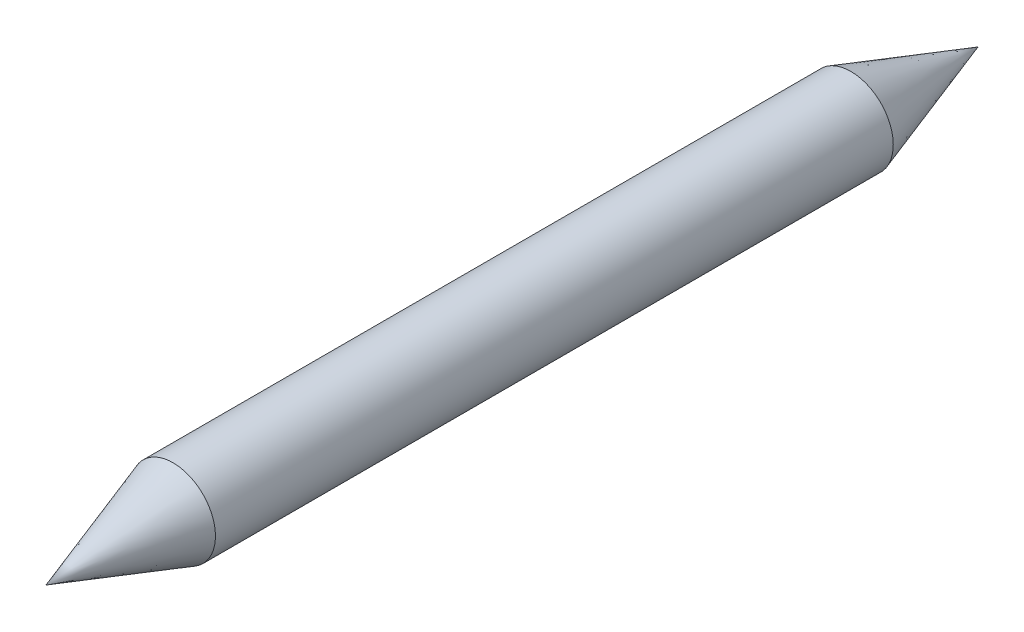
ISO-10303-21;
HEADER;
FILE_DESCRIPTION(('STEP AP214'),'2;1');
FILE_NAME('part.step','',(''),(''),'','','');
FILE_SCHEMA(('AUTOMOTIVE_DESIGN { 1 0 10303 214 1 1 1 1 }'));
ENDSEC;
DATA;
#1=APPLICATION_CONTEXT('core data for automotive mechanical design processes');
#2=APPLICATION_PROTOCOL_DEFINITION('international standard','automotive_design',2000,#1);
#3=PRODUCT_CONTEXT('',#1,'mechanical');
#4=PRODUCT('Part','Part','',(#3));
#5=PRODUCT_RELATED_PRODUCT_CATEGORY('part','',(#4));
#6=PRODUCT_DEFINITION_FORMATION('','',#4);
#7=PRODUCT_DEFINITION_CONTEXT('part definition',#1,'design');
#8=PRODUCT_DEFINITION('design','',#6,#7);
#9=PRODUCT_DEFINITION_SHAPE('','',#8);
#10=(LENGTH_UNIT() NAMED_UNIT(*) SI_UNIT(.MILLI.,.METRE.));
#11=(NAMED_UNIT(*) PLANE_ANGLE_UNIT() SI_UNIT($,.RADIAN.));
#12=(NAMED_UNIT(*) SI_UNIT($,.STERADIAN.) SOLID_ANGLE_UNIT());
#13=UNCERTAINTY_MEASURE_WITH_UNIT(LENGTH_MEASURE(1.E-05),#10,'distance_accuracy_value','');
#14=(GEOMETRIC_REPRESENTATION_CONTEXT(3) GLOBAL_UNCERTAINTY_ASSIGNED_CONTEXT((#13)) GLOBAL_UNIT_ASSIGNED_CONTEXT((#10,
#11,#12)) REPRESENTATION_CONTEXT('',''));
#15=CARTESIAN_POINT('',(0.,0.,0.));
#16=DIRECTION('',(0.,0.,1.));
#17=DIRECTION('',(1.,0.,0.));
#18=AXIS2_PLACEMENT_3D('',#15,#16,#17);
#19=CARTESIAN_POINT('',(0.,0.,-160.));
#20=DIRECTION('',(0.,0.,1.));
#21=DIRECTION('',(1.,0.,0.));
#22=AXIS2_PLACEMENT_3D('',#19,#20,#21);
#23=CYLINDRICAL_SURFACE('',#22,10.);
#24=CARTESIAN_POINT('',(0.,0.,-160.));
#25=DIRECTION('',(0.,0.,-1.));
#26=DIRECTION('',(-1.,0.,0.));
#27=AXIS2_PLACEMENT_3D('',#24,#25,#26);
#28=CIRCLE('',#27,10.);
#29=CARTESIAN_POINT('',(-10.,0.,-160.));
#30=VERTEX_POINT('',#29);
#31=EDGE_CURVE('E87',#30,#30,#28,.T.);
#32=ORIENTED_EDGE('',*,*,#31,.F.);
#33=EDGE_LOOP('',(#32));
#34=FACE_BOUND('',#33,.T.);
#35=CARTESIAN_POINT('',(0.,0.,0.));
#36=DIRECTION('',(0.,0.,-1.));
#37=DIRECTION('',(-1.,0.,0.));
#38=AXIS2_PLACEMENT_3D('',#35,#36,#37);
#39=CIRCLE('',#38,10.);
#40=CARTESIAN_POINT('',(-10.,0.,0.));
#41=VERTEX_POINT('',#40);
#42=EDGE_CURVE('E12',#41,#41,#39,.F.);
#43=ORIENTED_EDGE('',*,*,#42,.F.);
#44=EDGE_LOOP('',(#43));
#45=FACE_BOUND('',#44,.T.);
#46=ADVANCED_FACE('F51',(#34,#45),#23,.T.);
#47=CARTESIAN_POINT('',(0.,0.,30.));
#48=DIRECTION('',(0.,0.,-1.));
#49=DIRECTION('',(-1.,0.,0.));
#50=AXIS2_PLACEMENT_3D('',#47,#48,#49);
#51=CONICAL_SURFACE('',#50,0.,0.321750554396642);
#52=ORIENTED_EDGE('',*,*,#42,.T.);
#53=EDGE_LOOP('',(#52));
#54=FACE_BOUND('',#53,.T.);
#55=CARTESIAN_POINT('',(0.,0.,30.));
#56=VERTEX_POINT('',#55);
#57=VERTEX_LOOP('',#56);
#58=FACE_BOUND('',#57,.T.);
#59=ADVANCED_FACE('F69',(#54,#58),#51,.T.);
#60=CARTESIAN_POINT('',(0.,0.,-190.));
#61=DIRECTION('',(0.,0.,1.));
#62=DIRECTION('',(1.,0.,0.));
#63=AXIS2_PLACEMENT_3D('',#60,#61,#62);
#64=CONICAL_SURFACE('',#63,0.,0.321750554396642);
#65=ORIENTED_EDGE('',*,*,#31,.T.);
#66=EDGE_LOOP('',(#65));
#67=FACE_BOUND('',#66,.T.);
#68=CARTESIAN_POINT('',(0.,0.,-190.));
#69=VERTEX_POINT('',#68);
#70=VERTEX_LOOP('',#69);
#71=FACE_BOUND('',#70,.T.);
#72=ADVANCED_FACE('F67',(#67,#71),#64,.T.);
#73=CLOSED_SHELL('',(#46,#59,#72));
#74=CARTESIAN_POINT('',(0.,0.,-160.));
#75=DIRECTION('',(0.,0.,-1.));
#76=DIRECTION('',(-1.,0.,0.));
#77=AXIS2_PLACEMENT_3D('',#74,#75,#76);
#78=PLANE('',#77);
#79=CARTESIAN_POINT('',(0.,0.,-160.));
#80=DIRECTION('',(0.,0.,1.));
#81=DIRECTION('',(1.,0.,0.));
#82=AXIS2_PLACEMENT_3D('',#79,#80,#81);
#83=CIRCLE('',#82,9.);
#84=CARTESIAN_POINT('',(9.,0.,-160.));
#85=VERTEX_POINT('',#84);
#86=EDGE_CURVE('E61',#85,#85,#83,.T.);
#87=ORIENTED_EDGE('',*,*,#86,.T.);
#88=EDGE_LOOP('',(#87));
#89=FACE_BOUND('',#88,.T.);
#90=ADVANCED_FACE('F100',(#89),#78,.F.);
#91=CARTESIAN_POINT('',(0.,0.,0.));
#92=DIRECTION('',(0.,0.,1.));
#93=DIRECTION('',(1.,0.,0.));
#94=AXIS2_PLACEMENT_3D('',#91,#92,#93);
#95=PLANE('',#94);
#96=CARTESIAN_POINT('',(0.,0.,0.));
#97=DIRECTION('',(0.,0.,1.));
#98=DIRECTION('',(1.,0.,0.));
#99=AXIS2_PLACEMENT_3D('',#96,#97,#98);
#100=CIRCLE('',#99,9.);
#101=CARTESIAN_POINT('',(9.,0.,0.));
#102=VERTEX_POINT('',#101);
#103=EDGE_CURVE('E90',#102,#102,#100,.T.);
#104=ORIENTED_EDGE('',*,*,#103,.F.);
#105=EDGE_LOOP('',(#104));
#106=FACE_BOUND('',#105,.T.);
#107=ADVANCED_FACE('F105',(#106),#95,.F.);
#108=CARTESIAN_POINT('',(0.,0.,-160.));
#109=DIRECTION('',(0.,0.,1.));
#110=DIRECTION('',(1.,0.,0.));
#111=AXIS2_PLACEMENT_3D('',#108,#109,#110);
#112=CYLINDRICAL_SURFACE('',#111,9.);
#113=ORIENTED_EDGE('',*,*,#86,.F.);
#114=EDGE_LOOP('',(#113));
#115=FACE_BOUND('',#114,.T.);
#116=ORIENTED_EDGE('',*,*,#103,.T.);
#117=EDGE_LOOP('',(#116));
#118=FACE_BOUND('',#117,.T.);
#119=ADVANCED_FACE('F102',(#115,#118),#112,.F.);
#120=CLOSED_SHELL('',(#90,#107,#119));
#121=ORIENTED_CLOSED_SHELL('',*,#120,.T.);
#122=BREP_WITH_VOIDS('B2',#73,(#121));
#123=ADVANCED_BREP_SHAPE_REPRESENTATION('',(#18,#122),#14);
#124=SHAPE_DEFINITION_REPRESENTATION(#9,#123);
ENDSEC;
END-ISO-10303-21;
